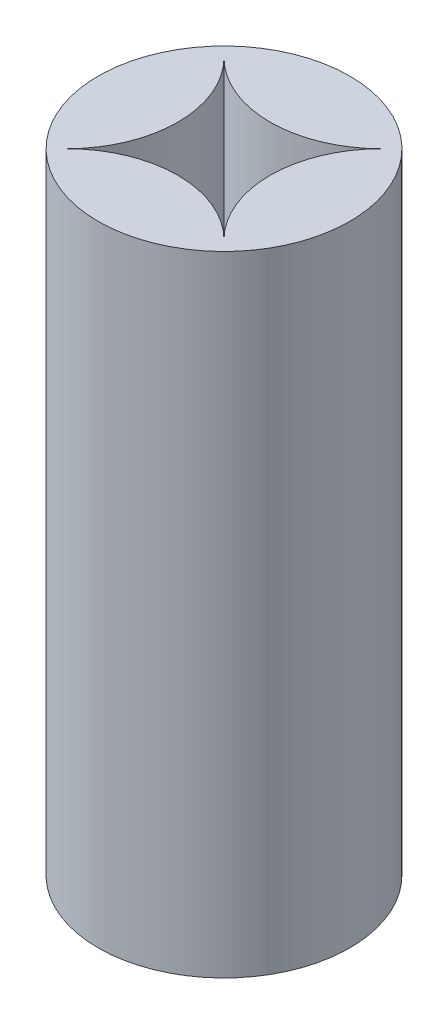
ISO-10303-21;
HEADER;
FILE_DESCRIPTION(('STEP AP214'),'2;1');
FILE_NAME('part.step','',(''),(''),'','','');
FILE_SCHEMA(('AUTOMOTIVE_DESIGN { 1 0 10303 214 1 1 1 1 }'));
ENDSEC;
DATA;
#1=APPLICATION_CONTEXT('core data for automotive mechanical design processes');
#2=APPLICATION_PROTOCOL_DEFINITION('international standard','automotive_design',2000,#1);
#3=PRODUCT_CONTEXT('',#1,'mechanical');
#4=PRODUCT('Part','Part','',(#3));
#5=PRODUCT_RELATED_PRODUCT_CATEGORY('part','',(#4));
#6=PRODUCT_DEFINITION_FORMATION('','',#4);
#7=PRODUCT_DEFINITION_CONTEXT('part definition',#1,'design');
#8=PRODUCT_DEFINITION('design','',#6,#7);
#9=PRODUCT_DEFINITION_SHAPE('','',#8);
#10=(LENGTH_UNIT() NAMED_UNIT(*) SI_UNIT(.MILLI.,.METRE.));
#11=(NAMED_UNIT(*) PLANE_ANGLE_UNIT() SI_UNIT($,.RADIAN.));
#12=(NAMED_UNIT(*) SI_UNIT($,.STERADIAN.) SOLID_ANGLE_UNIT());
#13=UNCERTAINTY_MEASURE_WITH_UNIT(LENGTH_MEASURE(1.E-05),#10,'distance_accuracy_value','');
#14=(GEOMETRIC_REPRESENTATION_CONTEXT(3) GLOBAL_UNCERTAINTY_ASSIGNED_CONTEXT((#13)) GLOBAL_UNIT_ASSIGNED_CONTEXT((#10,
#11,#12)) REPRESENTATION_CONTEXT('',''));
#15=CARTESIAN_POINT('',(0.,0.,0.));
#16=DIRECTION('',(0.,0.,1.));
#17=DIRECTION('',(1.,0.,0.));
#18=AXIS2_PLACEMENT_3D('',#15,#16,#17);
#19=CARTESIAN_POINT('',(0.,20.,0.));
#20=DIRECTION('',(0.,1.,0.));
#21=DIRECTION('',(0.,0.,1.));
#22=AXIS2_PLACEMENT_3D('',#19,#20,#21);
#23=PLANE('',#22);
#24=CARTESIAN_POINT('',(0.,20.,0.));
#25=DIRECTION('',(0.,1.,0.));
#26=DIRECTION('',(0.,0.,1.));
#27=AXIS2_PLACEMENT_3D('',#24,#25,#26);
#28=CIRCLE('',#27,4.);
#29=CARTESIAN_POINT('',(0.,20.,4.));
#30=VERTEX_POINT('',#29);
#31=EDGE_CURVE('E11',#30,#30,#28,.T.);
#32=ORIENTED_EDGE('',*,*,#31,.T.);
#33=EDGE_LOOP('',(#32));
#34=FACE_BOUND('',#33,.T.);
#35=CARTESIAN_POINT('',(5.,20.,0.));
#36=DIRECTION('',(0.,-1.,0.));
#37=DIRECTION('',(0.,0.,-1.));
#38=AXIS2_PLACEMENT_3D('',#35,#36,#37);
#39=CIRCLE('',#38,3.53553390593274);
#40=CARTESIAN_POINT('',(2.5,20.,2.5));
#41=VERTEX_POINT('',#40);
#42=CARTESIAN_POINT('',(2.5,20.,-2.5));
#43=VERTEX_POINT('',#42);
#44=EDGE_CURVE('E55',#41,#43,#39,.T.);
#45=ORIENTED_EDGE('',*,*,#44,.F.);
#46=CARTESIAN_POINT('',(0.,20.,5.));
#47=DIRECTION('',(0.,-1.,0.));
#48=DIRECTION('',(0.,0.,-1.));
#49=AXIS2_PLACEMENT_3D('',#46,#47,#48);
#50=CIRCLE('',#49,3.53553390593274);
#51=CARTESIAN_POINT('',(-2.5,20.,2.5));
#52=VERTEX_POINT('',#51);
#53=EDGE_CURVE('E110',#52,#41,#50,.T.);
#54=ORIENTED_EDGE('',*,*,#53,.F.);
#55=CARTESIAN_POINT('',(-5.,20.,0.));
#56=DIRECTION('',(0.,-1.,0.));
#57=DIRECTION('',(0.,0.,-1.));
#58=AXIS2_PLACEMENT_3D('',#55,#56,#57);
#59=CIRCLE('',#58,3.53553390593274);
#60=CARTESIAN_POINT('',(-2.5,20.,-2.5));
#61=VERTEX_POINT('',#60);
#62=EDGE_CURVE('E119',#61,#52,#59,.T.);
#63=ORIENTED_EDGE('',*,*,#62,.F.);
#64=CARTESIAN_POINT('',(0.,20.,-5.));
#65=DIRECTION('',(0.,-1.,0.));
#66=DIRECTION('',(0.,0.,-1.));
#67=AXIS2_PLACEMENT_3D('',#64,#65,#66);
#68=CIRCLE('',#67,3.53553390593274);
#69=EDGE_CURVE('E90',#43,#61,#68,.T.);
#70=ORIENTED_EDGE('',*,*,#69,.F.);
#71=EDGE_LOOP('',(#45,#54,#63,#70));
#72=FACE_BOUND('',#71,.T.);
#73=ADVANCED_FACE('F39',(#34,#72),#23,.T.);
#74=CARTESIAN_POINT('',(0.,20.,0.));
#75=DIRECTION('',(0.,-1.,0.));
#76=DIRECTION('',(0.,0.,-1.));
#77=AXIS2_PLACEMENT_3D('',#74,#75,#76);
#78=CYLINDRICAL_SURFACE('',#77,4.);
#79=ORIENTED_EDGE('',*,*,#31,.F.);
#80=EDGE_LOOP('',(#79));
#81=FACE_BOUND('',#80,.T.);
#82=CARTESIAN_POINT('',(0.,0.,0.));
#83=DIRECTION('',(0.,1.,0.));
#84=DIRECTION('',(0.,0.,1.));
#85=AXIS2_PLACEMENT_3D('',#82,#83,#84);
#86=CIRCLE('',#85,4.);
#87=CARTESIAN_POINT('',(0.,0.,4.));
#88=VERTEX_POINT('',#87);
#89=EDGE_CURVE('E43',#88,#88,#86,.T.);
#90=ORIENTED_EDGE('',*,*,#89,.T.);
#91=EDGE_LOOP('',(#90));
#92=FACE_BOUND('',#91,.T.);
#93=ADVANCED_FACE('F41',(#81,#92),#78,.T.);
#94=CARTESIAN_POINT('',(0.,0.,0.));
#95=DIRECTION('',(0.,1.,0.));
#96=DIRECTION('',(0.,0.,1.));
#97=AXIS2_PLACEMENT_3D('',#94,#95,#96);
#98=PLANE('',#97);
#99=ORIENTED_EDGE('',*,*,#89,.F.);
#100=EDGE_LOOP('',(#99));
#101=FACE_BOUND('',#100,.T.);
#102=ADVANCED_FACE('F140',(#101),#98,.F.);
#103=CARTESIAN_POINT('',(5.,10.,0.));
#104=DIRECTION('',(0.,1.,0.));
#105=DIRECTION('',(0.,0.,1.));
#106=AXIS2_PLACEMENT_3D('',#103,#104,#105);
#107=CYLINDRICAL_SURFACE('',#106,3.53553390593274);
#108=ORIENTED_EDGE('',*,*,#44,.T.);
#109=DIRECTION('',(0.,1.,0.));
#110=VECTOR('',#109,1.);
#111=CARTESIAN_POINT('',(2.5,10.,-2.5));
#112=LINE('',#111,#110);
#113=CARTESIAN_POINT('',(2.5,10.,-2.5));
#114=VERTEX_POINT('',#113);
#115=EDGE_CURVE('E78',#114,#43,#112,.T.);
#116=ORIENTED_EDGE('',*,*,#115,.F.);
#117=CARTESIAN_POINT('',(5.,10.,0.));
#118=DIRECTION('',(0.,-1.,0.));
#119=DIRECTION('',(0.,0.,-1.));
#120=AXIS2_PLACEMENT_3D('',#117,#118,#119);
#121=CIRCLE('',#120,3.53553390593274);
#122=CARTESIAN_POINT('',(2.5,10.,2.5));
#123=VERTEX_POINT('',#122);
#124=EDGE_CURVE('E106',#123,#114,#121,.T.);
#125=ORIENTED_EDGE('',*,*,#124,.F.);
#126=DIRECTION('',(0.,1.,0.));
#127=VECTOR('',#126,1.);
#128=CARTESIAN_POINT('',(2.5,10.,2.5));
#129=LINE('',#128,#127);
#130=EDGE_CURVE('E63',#123,#41,#129,.T.);
#131=ORIENTED_EDGE('',*,*,#130,.T.);
#132=EDGE_LOOP('',(#108,#116,#125,#131));
#133=FACE_BOUND('',#132,.T.);
#134=ADVANCED_FACE('F133',(#133),#107,.T.);
#135=CARTESIAN_POINT('',(0.,10.,5.));
#136=DIRECTION('',(0.,1.,0.));
#137=DIRECTION('',(0.,0.,1.));
#138=AXIS2_PLACEMENT_3D('',#135,#136,#137);
#139=CYLINDRICAL_SURFACE('',#138,3.53553390593274);
#140=ORIENTED_EDGE('',*,*,#53,.T.);
#141=ORIENTED_EDGE('',*,*,#130,.F.);
#142=CARTESIAN_POINT('',(0.,10.,5.));
#143=DIRECTION('',(0.,-1.,0.));
#144=DIRECTION('',(0.,0.,-1.));
#145=AXIS2_PLACEMENT_3D('',#142,#143,#144);
#146=CIRCLE('',#145,3.53553390593274);
#147=CARTESIAN_POINT('',(-2.5,10.,2.5));
#148=VERTEX_POINT('',#147);
#149=EDGE_CURVE('E103',#148,#123,#146,.T.);
#150=ORIENTED_EDGE('',*,*,#149,.F.);
#151=DIRECTION('',(0.,1.,0.));
#152=VECTOR('',#151,1.);
#153=CARTESIAN_POINT('',(-2.5,10.,2.5));
#154=LINE('',#153,#152);
#155=EDGE_CURVE('E95',#148,#52,#154,.T.);
#156=ORIENTED_EDGE('',*,*,#155,.T.);
#157=EDGE_LOOP('',(#140,#141,#150,#156));
#158=FACE_BOUND('',#157,.T.);
#159=ADVANCED_FACE('F131',(#158),#139,.T.);
#160=CARTESIAN_POINT('',(-5.,10.,0.));
#161=DIRECTION('',(0.,1.,0.));
#162=DIRECTION('',(0.,0.,1.));
#163=AXIS2_PLACEMENT_3D('',#160,#161,#162);
#164=CYLINDRICAL_SURFACE('',#163,3.53553390593274);
#165=ORIENTED_EDGE('',*,*,#62,.T.);
#166=ORIENTED_EDGE('',*,*,#155,.F.);
#167=CARTESIAN_POINT('',(-5.,10.,0.));
#168=DIRECTION('',(0.,-1.,0.));
#169=DIRECTION('',(0.,0.,-1.));
#170=AXIS2_PLACEMENT_3D('',#167,#168,#169);
#171=CIRCLE('',#170,3.53553390593274);
#172=CARTESIAN_POINT('',(-2.5,10.,-2.5));
#173=VERTEX_POINT('',#172);
#174=EDGE_CURVE('E98',#173,#148,#171,.T.);
#175=ORIENTED_EDGE('',*,*,#174,.F.);
#176=DIRECTION('',(0.,1.,0.));
#177=VECTOR('',#176,1.);
#178=CARTESIAN_POINT('',(-2.5,10.,-2.5));
#179=LINE('',#178,#177);
#180=EDGE_CURVE('E83',#173,#61,#179,.T.);
#181=ORIENTED_EDGE('',*,*,#180,.T.);
#182=EDGE_LOOP('',(#165,#166,#175,#181));
#183=FACE_BOUND('',#182,.T.);
#184=ADVANCED_FACE('F99',(#183),#164,.T.);
#185=CARTESIAN_POINT('',(0.,10.,-5.));
#186=DIRECTION('',(0.,1.,0.));
#187=DIRECTION('',(0.,0.,1.));
#188=AXIS2_PLACEMENT_3D('',#185,#186,#187);
#189=CYLINDRICAL_SURFACE('',#188,3.53553390593274);
#190=ORIENTED_EDGE('',*,*,#69,.T.);
#191=ORIENTED_EDGE('',*,*,#180,.F.);
#192=CARTESIAN_POINT('',(0.,10.,-5.));
#193=DIRECTION('',(0.,-1.,0.));
#194=DIRECTION('',(0.,0.,-1.));
#195=AXIS2_PLACEMENT_3D('',#192,#193,#194);
#196=CIRCLE('',#195,3.53553390593274);
#197=EDGE_CURVE('E87',#114,#173,#196,.T.);
#198=ORIENTED_EDGE('',*,*,#197,.F.);
#199=ORIENTED_EDGE('',*,*,#115,.T.);
#200=EDGE_LOOP('',(#190,#191,#198,#199));
#201=FACE_BOUND('',#200,.T.);
#202=ADVANCED_FACE('F85',(#201),#189,.T.);
#203=CARTESIAN_POINT('',(2.5,10.,-2.5));
#204=DIRECTION('',(0.,-1.,0.));
#205=DIRECTION('',(0.,0.,-1.));
#206=AXIS2_PLACEMENT_3D('',#203,#204,#205);
#207=PLANE('',#206);
#208=ORIENTED_EDGE('',*,*,#124,.T.);
#209=ORIENTED_EDGE('',*,*,#197,.T.);
#210=ORIENTED_EDGE('',*,*,#174,.T.);
#211=ORIENTED_EDGE('',*,*,#149,.T.);
#212=EDGE_LOOP('',(#208,#209,#210,#211));
#213=FACE_BOUND('',#212,.T.);
#214=ADVANCED_FACE('F105',(#213),#207,.F.);
#215=CLOSED_SHELL('',(#73,#93,#102,#134,#159,#184,#202,#214));
#216=MANIFOLD_SOLID_BREP('B2',#215);
#217=ADVANCED_BREP_SHAPE_REPRESENTATION('',(#18,#216),#14);
#218=SHAPE_DEFINITION_REPRESENTATION(#9,#217);
ENDSEC;
END-ISO-10303-21;
